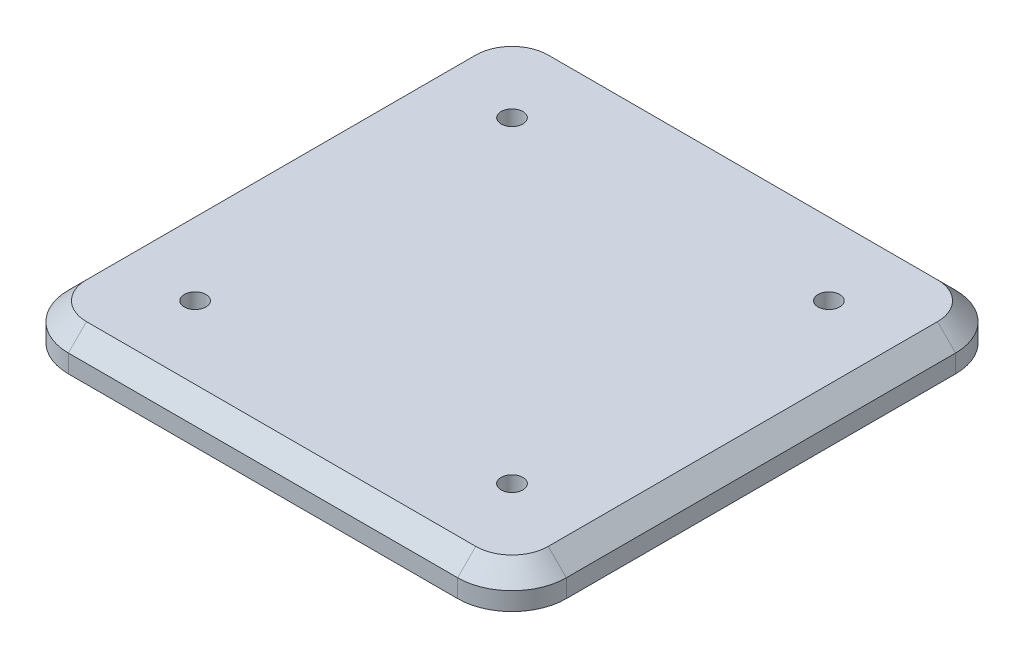
ISO-10303-21;
HEADER;
FILE_DESCRIPTION(('STEP AP214'),'2;1');
FILE_NAME('part.step','',(''),(''),'','','');
FILE_SCHEMA(('AUTOMOTIVE_DESIGN { 1 0 10303 214 1 1 1 1 }'));
ENDSEC;
DATA;
#1=APPLICATION_CONTEXT('core data for automotive mechanical design processes');
#2=APPLICATION_PROTOCOL_DEFINITION('international standard','automotive_design',2000,#1);
#3=PRODUCT_CONTEXT('',#1,'mechanical');
#4=PRODUCT('Part','Part','',(#3));
#5=PRODUCT_RELATED_PRODUCT_CATEGORY('part','',(#4));
#6=PRODUCT_DEFINITION_FORMATION('','',#4);
#7=PRODUCT_DEFINITION_CONTEXT('part definition',#1,'design');
#8=PRODUCT_DEFINITION('design','',#6,#7);
#9=PRODUCT_DEFINITION_SHAPE('','',#8);
#10=(LENGTH_UNIT() NAMED_UNIT(*) SI_UNIT(.MILLI.,.METRE.));
#11=(NAMED_UNIT(*) PLANE_ANGLE_UNIT() SI_UNIT($,.RADIAN.));
#12=(NAMED_UNIT(*) SI_UNIT($,.STERADIAN.) SOLID_ANGLE_UNIT());
#13=UNCERTAINTY_MEASURE_WITH_UNIT(LENGTH_MEASURE(1.E-05),#10,'distance_accuracy_value','');
#14=(GEOMETRIC_REPRESENTATION_CONTEXT(3) GLOBAL_UNCERTAINTY_ASSIGNED_CONTEXT((#13)) GLOBAL_UNIT_ASSIGNED_CONTEXT((#10,
#11,#12)) REPRESENTATION_CONTEXT('',''));
#15=CARTESIAN_POINT('',(0.,0.,0.));
#16=DIRECTION('',(0.,0.,1.));
#17=DIRECTION('',(1.,0.,0.));
#18=AXIS2_PLACEMENT_3D('',#15,#16,#17);
#19=CARTESIAN_POINT('',(0.,20.,0.));
#20=DIRECTION('',(1.,0.,0.));
#21=DIRECTION('',(0.,0.,-1.));
#22=AXIS2_PLACEMENT_3D('',#19,#20,#21);
#23=PLANE('',#22);
#24=DIRECTION('',(0.,-1.,0.));
#25=VECTOR('',#24,1.);
#26=CARTESIAN_POINT('',(0.,20.,-30.));
#27=LINE('',#26,#25);
#28=CARTESIAN_POINT('',(0.,0.,-30.));
#29=VERTEX_POINT('',#28);
#30=CARTESIAN_POINT('',(0.,9.99999999999999,-30.));
#31=VERTEX_POINT('',#30);
#32=EDGE_CURVE('E215',#29,#31,#27,.F.);
#33=ORIENTED_EDGE('',*,*,#32,.T.);
#34=DIRECTION('',(0.,0.,-1.));
#35=VECTOR('',#34,1.);
#36=CARTESIAN_POINT('',(0.,9.99999999999999,0.));
#37=LINE('',#36,#35);
#38=CARTESIAN_POINT('',(0.,9.99999999999999,-245.));
#39=VERTEX_POINT('',#38);
#40=EDGE_CURVE('E259',#31,#39,#37,.T.);
#41=ORIENTED_EDGE('',*,*,#40,.T.);
#42=DIRECTION('',(0.,-1.,0.));
#43=VECTOR('',#42,1.);
#44=CARTESIAN_POINT('',(0.,20.,-245.));
#45=LINE('',#44,#43);
#46=CARTESIAN_POINT('',(0.,0.,-245.));
#47=VERTEX_POINT('',#46);
#48=EDGE_CURVE('E218',#39,#47,#45,.T.);
#49=ORIENTED_EDGE('',*,*,#48,.T.);
#50=DIRECTION('',(0.,0.,1.));
#51=VECTOR('',#50,1.);
#52=CARTESIAN_POINT('',(0.,0.,0.));
#53=LINE('',#52,#51);
#54=EDGE_CURVE('E203',#47,#29,#53,.T.);
#55=ORIENTED_EDGE('',*,*,#54,.T.);
#56=EDGE_LOOP('',(#33,#41,#49,#55));
#57=FACE_BOUND('',#56,.T.);
#58=ADVANCED_FACE('F33',(#57),#23,.F.);
#59=CARTESIAN_POINT('',(0.,20.,0.));
#60=DIRECTION('',(0.,0.,-1.));
#61=DIRECTION('',(-1.,0.,0.));
#62=AXIS2_PLACEMENT_3D('',#59,#60,#61);
#63=PLANE('',#62);
#64=DIRECTION('',(0.,-1.,0.));
#65=VECTOR('',#64,1.);
#66=CARTESIAN_POINT('',(245.,20.,0.));
#67=LINE('',#66,#65);
#68=CARTESIAN_POINT('',(245.,0.,0.));
#69=VERTEX_POINT('',#68);
#70=CARTESIAN_POINT('',(245.,9.99999999999999,0.));
#71=VERTEX_POINT('',#70);
#72=EDGE_CURVE('E239',#69,#71,#67,.F.);
#73=ORIENTED_EDGE('',*,*,#72,.T.);
#74=DIRECTION('',(-1.,0.,0.));
#75=VECTOR('',#74,1.);
#76=CARTESIAN_POINT('',(0.,9.99999999999999,0.));
#77=LINE('',#76,#75);
#78=CARTESIAN_POINT('',(30.,9.99999999999999,0.));
#79=VERTEX_POINT('',#78);
#80=EDGE_CURVE('E266',#71,#79,#77,.T.);
#81=ORIENTED_EDGE('',*,*,#80,.T.);
#82=DIRECTION('',(0.,-1.,0.));
#83=VECTOR('',#82,1.);
#84=CARTESIAN_POINT('',(30.,20.,0.));
#85=LINE('',#84,#83);
#86=CARTESIAN_POINT('',(30.,0.,0.));
#87=VERTEX_POINT('',#86);
#88=EDGE_CURVE('E237',#79,#87,#85,.T.);
#89=ORIENTED_EDGE('',*,*,#88,.T.);
#90=DIRECTION('',(1.,0.,0.));
#91=VECTOR('',#90,1.);
#92=CARTESIAN_POINT('',(0.,0.,0.));
#93=LINE('',#92,#91);
#94=EDGE_CURVE('E206',#87,#69,#93,.T.);
#95=ORIENTED_EDGE('',*,*,#94,.T.);
#96=EDGE_LOOP('',(#73,#81,#89,#95));
#97=FACE_BOUND('',#96,.T.);
#98=ADVANCED_FACE('F309',(#97),#63,.F.);
#99=CARTESIAN_POINT('',(275.,20.,0.));
#100=DIRECTION('',(-1.,0.,0.));
#101=DIRECTION('',(0.,0.,1.));
#102=AXIS2_PLACEMENT_3D('',#99,#100,#101);
#103=PLANE('',#102);
#104=DIRECTION('',(0.,-1.,0.));
#105=VECTOR('',#104,1.);
#106=CARTESIAN_POINT('',(275.,20.,-245.));
#107=LINE('',#106,#105);
#108=CARTESIAN_POINT('',(275.,0.,-245.));
#109=VERTEX_POINT('',#108);
#110=CARTESIAN_POINT('',(275.,9.99999999999999,-245.));
#111=VERTEX_POINT('',#110);
#112=EDGE_CURVE('E235',#109,#111,#107,.F.);
#113=ORIENTED_EDGE('',*,*,#112,.T.);
#114=DIRECTION('',(0.,0.,1.));
#115=VECTOR('',#114,1.);
#116=CARTESIAN_POINT('',(275.,9.99999999999999,0.));
#117=LINE('',#116,#115);
#118=CARTESIAN_POINT('',(275.,9.99999999999999,-30.));
#119=VERTEX_POINT('',#118);
#120=EDGE_CURVE('E11',#111,#119,#117,.T.);
#121=ORIENTED_EDGE('',*,*,#120,.T.);
#122=DIRECTION('',(0.,-1.,0.));
#123=VECTOR('',#122,1.);
#124=CARTESIAN_POINT('',(275.,20.,-30.));
#125=LINE('',#124,#123);
#126=CARTESIAN_POINT('',(275.,0.,-30.));
#127=VERTEX_POINT('',#126);
#128=EDGE_CURVE('E233',#119,#127,#125,.T.);
#129=ORIENTED_EDGE('',*,*,#128,.T.);
#130=DIRECTION('',(0.,0.,-1.));
#131=VECTOR('',#130,1.);
#132=CARTESIAN_POINT('',(275.,0.,0.));
#133=LINE('',#132,#131);
#134=EDGE_CURVE('E209',#127,#109,#133,.T.);
#135=ORIENTED_EDGE('',*,*,#134,.T.);
#136=EDGE_LOOP('',(#113,#121,#129,#135));
#137=FACE_BOUND('',#136,.T.);
#138=ADVANCED_FACE('F319',(#137),#103,.F.);
#139=CARTESIAN_POINT('',(0.,20.,-275.));
#140=DIRECTION('',(0.,0.,1.));
#141=DIRECTION('',(1.,0.,0.));
#142=AXIS2_PLACEMENT_3D('',#139,#140,#141);
#143=PLANE('',#142);
#144=DIRECTION('',(0.,-1.,0.));
#145=VECTOR('',#144,1.);
#146=CARTESIAN_POINT('',(30.,20.,-275.));
#147=LINE('',#146,#145);
#148=CARTESIAN_POINT('',(30.,0.,-275.));
#149=VERTEX_POINT('',#148);
#150=CARTESIAN_POINT('',(30.,9.99999999999999,-275.));
#151=VERTEX_POINT('',#150);
#152=EDGE_CURVE('E230',#149,#151,#147,.F.);
#153=ORIENTED_EDGE('',*,*,#152,.T.);
#154=DIRECTION('',(1.,0.,0.));
#155=VECTOR('',#154,1.);
#156=CARTESIAN_POINT('',(0.,9.99999999999999,-275.));
#157=LINE('',#156,#155);
#158=CARTESIAN_POINT('',(245.,9.99999999999999,-275.));
#159=VERTEX_POINT('',#158);
#160=EDGE_CURVE('E268',#151,#159,#157,.T.);
#161=ORIENTED_EDGE('',*,*,#160,.T.);
#162=DIRECTION('',(0.,-1.,0.));
#163=VECTOR('',#162,1.);
#164=CARTESIAN_POINT('',(245.,20.,-275.));
#165=LINE('',#164,#163);
#166=CARTESIAN_POINT('',(245.,0.,-275.));
#167=VERTEX_POINT('',#166);
#168=EDGE_CURVE('E228',#159,#167,#165,.T.);
#169=ORIENTED_EDGE('',*,*,#168,.T.);
#170=DIRECTION('',(-1.,0.,0.));
#171=VECTOR('',#170,1.);
#172=CARTESIAN_POINT('',(0.,0.,-275.));
#173=LINE('',#172,#171);
#174=EDGE_CURVE('E212',#167,#149,#173,.T.);
#175=ORIENTED_EDGE('',*,*,#174,.T.);
#176=EDGE_LOOP('',(#153,#161,#169,#175));
#177=FACE_BOUND('',#176,.T.);
#178=ADVANCED_FACE('F324',(#177),#143,.F.);
#179=CARTESIAN_POINT('',(0.,20.,0.));
#180=DIRECTION('',(0.,-1.,0.));
#181=DIRECTION('',(0.,0.,-1.));
#182=AXIS2_PLACEMENT_3D('',#179,#180,#181);
#183=PLANE('',#182);
#184=CARTESIAN_POINT('',(50.,20.,-50.));
#185=DIRECTION('',(0.,1.,0.));
#186=DIRECTION('',(0.,0.,1.));
#187=AXIS2_PLACEMENT_3D('',#184,#185,#186);
#188=CIRCLE('',#187,5.99999999999999);
#189=CARTESIAN_POINT('',(50.,20.,-44.));
#190=VERTEX_POINT('',#189);
#191=EDGE_CURVE('E156',#190,#190,#188,.T.);
#192=ORIENTED_EDGE('',*,*,#191,.F.);
#193=EDGE_LOOP('',(#192));
#194=FACE_BOUND('',#193,.T.);
#195=CARTESIAN_POINT('',(50.,20.,-225.));
#196=DIRECTION('',(0.,1.,0.));
#197=DIRECTION('',(0.,0.,1.));
#198=AXIS2_PLACEMENT_3D('',#195,#196,#197);
#199=CIRCLE('',#198,5.99999999999999);
#200=CARTESIAN_POINT('',(50.,20.,-219.));
#201=VERTEX_POINT('',#200);
#202=EDGE_CURVE('E155',#201,#201,#199,.T.);
#203=ORIENTED_EDGE('',*,*,#202,.F.);
#204=EDGE_LOOP('',(#203));
#205=FACE_BOUND('',#204,.T.);
#206=CARTESIAN_POINT('',(225.,20.,-225.));
#207=DIRECTION('',(0.,1.,0.));
#208=DIRECTION('',(0.,0.,1.));
#209=AXIS2_PLACEMENT_3D('',#206,#207,#208);
#210=CIRCLE('',#209,5.99999999999998);
#211=CARTESIAN_POINT('',(225.,20.,-219.));
#212=VERTEX_POINT('',#211);
#213=EDGE_CURVE('E166',#212,#212,#210,.T.);
#214=ORIENTED_EDGE('',*,*,#213,.F.);
#215=EDGE_LOOP('',(#214));
#216=FACE_BOUND('',#215,.T.);
#217=CARTESIAN_POINT('',(225.,20.,-50.));
#218=DIRECTION('',(0.,1.,0.));
#219=DIRECTION('',(0.,0.,1.));
#220=AXIS2_PLACEMENT_3D('',#217,#218,#219);
#221=CIRCLE('',#220,5.99999999999998);
#222=CARTESIAN_POINT('',(225.,20.,-44.));
#223=VERTEX_POINT('',#222);
#224=EDGE_CURVE('E172',#223,#223,#221,.T.);
#225=ORIENTED_EDGE('',*,*,#224,.F.);
#226=EDGE_LOOP('',(#225));
#227=FACE_BOUND('',#226,.T.);
#228=CARTESIAN_POINT('',(30.,20.,-245.));
#229=DIRECTION('',(0.,-1.,0.));
#230=DIRECTION('',(0.,0.,-1.));
#231=AXIS2_PLACEMENT_3D('',#228,#229,#230);
#232=CIRCLE('',#231,20.0000000000001);
#233=CARTESIAN_POINT('',(30.,20.,-265.));
#234=VERTEX_POINT('',#233);
#235=CARTESIAN_POINT('',(9.9999999999999,20.,-245.));
#236=VERTEX_POINT('',#235);
#237=EDGE_CURVE('E252',#234,#236,#232,.F.);
#238=ORIENTED_EDGE('',*,*,#237,.T.);
#239=DIRECTION('',(0.,0.,1.));
#240=VECTOR('',#239,1.);
#241=CARTESIAN_POINT('',(9.9999999999999,20.,0.));
#242=LINE('',#241,#240);
#243=CARTESIAN_POINT('',(9.9999999999999,20.,-30.));
#244=VERTEX_POINT('',#243);
#245=EDGE_CURVE('E256',#236,#244,#242,.T.);
#246=ORIENTED_EDGE('',*,*,#245,.T.);
#247=CARTESIAN_POINT('',(30.,20.,-30.));
#248=DIRECTION('',(0.,-1.,0.));
#249=DIRECTION('',(0.,0.,-1.));
#250=AXIS2_PLACEMENT_3D('',#247,#248,#249);
#251=CIRCLE('',#250,20.0000000000001);
#252=CARTESIAN_POINT('',(30.,20.,-9.9999999999999));
#253=VERTEX_POINT('',#252);
#254=EDGE_CURVE('E254',#244,#253,#251,.F.);
#255=ORIENTED_EDGE('',*,*,#254,.T.);
#256=DIRECTION('',(1.,0.,0.));
#257=VECTOR('',#256,1.);
#258=CARTESIAN_POINT('',(0.,20.,-9.9999999999999));
#259=LINE('',#258,#257);
#260=CARTESIAN_POINT('',(245.,20.,-9.9999999999999));
#261=VERTEX_POINT('',#260);
#262=EDGE_CURVE('E250',#253,#261,#259,.T.);
#263=ORIENTED_EDGE('',*,*,#262,.T.);
#264=CARTESIAN_POINT('',(245.,20.,-30.));
#265=DIRECTION('',(0.,-1.,0.));
#266=DIRECTION('',(0.,0.,-1.));
#267=AXIS2_PLACEMENT_3D('',#264,#265,#266);
#268=CIRCLE('',#267,20.0000000000001);
#269=CARTESIAN_POINT('',(265.,20.,-30.));
#270=VERTEX_POINT('',#269);
#271=EDGE_CURVE('E246',#261,#270,#268,.F.);
#272=ORIENTED_EDGE('',*,*,#271,.T.);
#273=DIRECTION('',(0.,0.,-1.));
#274=VECTOR('',#273,1.);
#275=CARTESIAN_POINT('',(265.,20.,0.));
#276=LINE('',#275,#274);
#277=CARTESIAN_POINT('',(265.,20.,-245.));
#278=VERTEX_POINT('',#277);
#279=EDGE_CURVE('E242',#270,#278,#276,.T.);
#280=ORIENTED_EDGE('',*,*,#279,.T.);
#281=CARTESIAN_POINT('',(245.,20.,-245.));
#282=DIRECTION('',(0.,-1.,0.));
#283=DIRECTION('',(0.,0.,-1.));
#284=AXIS2_PLACEMENT_3D('',#281,#282,#283);
#285=CIRCLE('',#284,20.0000000000001);
#286=CARTESIAN_POINT('',(245.,20.,-265.));
#287=VERTEX_POINT('',#286);
#288=EDGE_CURVE('E244',#278,#287,#285,.F.);
#289=ORIENTED_EDGE('',*,*,#288,.T.);
#290=DIRECTION('',(-1.,0.,0.));
#291=VECTOR('',#290,1.);
#292=CARTESIAN_POINT('',(0.,20.,-265.));
#293=LINE('',#292,#291);
#294=EDGE_CURVE('E248',#287,#234,#293,.T.);
#295=ORIENTED_EDGE('',*,*,#294,.T.);
#296=EDGE_LOOP('',(#238,#246,#255,#263,#272,#280,#289,#295));
#297=FACE_BOUND('',#296,.T.);
#298=ADVANCED_FACE('F349',(#194,#205,#216,#227,#297),#183,.F.);
#299=CARTESIAN_POINT('',(0.,0.,0.));
#300=DIRECTION('',(0.,-1.,0.));
#301=DIRECTION('',(0.,0.,-1.));
#302=AXIS2_PLACEMENT_3D('',#299,#300,#301);
#303=PLANE('',#302);
#304=CARTESIAN_POINT('',(25.,0.,-25.));
#305=DIRECTION('',(0.,-1.,0.));
#306=DIRECTION('',(0.,0.,-1.));
#307=AXIS2_PLACEMENT_3D('',#304,#305,#306);
#308=CIRCLE('',#307,5.99999999999999);
#309=CARTESIAN_POINT('',(25.,0.,-31.));
#310=VERTEX_POINT('',#309);
#311=EDGE_CURVE('E178',#310,#310,#308,.T.);
#312=ORIENTED_EDGE('',*,*,#311,.F.);
#313=EDGE_LOOP('',(#312));
#314=FACE_BOUND('',#313,.T.);
#315=CARTESIAN_POINT('',(250.,0.,-25.));
#316=DIRECTION('',(0.,-1.,0.));
#317=DIRECTION('',(0.,0.,-1.));
#318=AXIS2_PLACEMENT_3D('',#315,#316,#317);
#319=CIRCLE('',#318,6.00000000000001);
#320=CARTESIAN_POINT('',(250.,0.,-31.));
#321=VERTEX_POINT('',#320);
#322=EDGE_CURVE('E184',#321,#321,#319,.T.);
#323=ORIENTED_EDGE('',*,*,#322,.F.);
#324=EDGE_LOOP('',(#323));
#325=FACE_BOUND('',#324,.T.);
#326=CARTESIAN_POINT('',(250.,0.,-250.));
#327=DIRECTION('',(0.,-1.,0.));
#328=DIRECTION('',(0.,0.,-1.));
#329=AXIS2_PLACEMENT_3D('',#326,#327,#328);
#330=CIRCLE('',#329,6.00000000000001);
#331=CARTESIAN_POINT('',(250.,0.,-256.));
#332=VERTEX_POINT('',#331);
#333=EDGE_CURVE('E190',#332,#332,#330,.T.);
#334=ORIENTED_EDGE('',*,*,#333,.F.);
#335=EDGE_LOOP('',(#334));
#336=FACE_BOUND('',#335,.T.);
#337=CARTESIAN_POINT('',(25.,0.,-250.));
#338=DIRECTION('',(0.,-1.,0.));
#339=DIRECTION('',(0.,0.,-1.));
#340=AXIS2_PLACEMENT_3D('',#337,#338,#339);
#341=CIRCLE('',#340,5.99999999999999);
#342=CARTESIAN_POINT('',(25.,0.,-256.));
#343=VERTEX_POINT('',#342);
#344=EDGE_CURVE('E196',#343,#343,#341,.T.);
#345=ORIENTED_EDGE('',*,*,#344,.F.);
#346=EDGE_LOOP('',(#345));
#347=FACE_BOUND('',#346,.T.);
#348=ORIENTED_EDGE('',*,*,#54,.F.);
#349=CARTESIAN_POINT('',(30.,0.,-245.));
#350=DIRECTION('',(0.,-1.,0.));
#351=DIRECTION('',(0.,0.,-1.));
#352=AXIS2_PLACEMENT_3D('',#349,#350,#351);
#353=CIRCLE('',#352,30.);
#354=EDGE_CURVE('E226',#47,#149,#353,.T.);
#355=ORIENTED_EDGE('',*,*,#354,.T.);
#356=ORIENTED_EDGE('',*,*,#174,.F.);
#357=CARTESIAN_POINT('',(245.,0.,-245.));
#358=DIRECTION('',(0.,-1.,0.));
#359=DIRECTION('',(0.,0.,-1.));
#360=AXIS2_PLACEMENT_3D('',#357,#358,#359);
#361=CIRCLE('',#360,30.);
#362=EDGE_CURVE('E224',#167,#109,#361,.T.);
#363=ORIENTED_EDGE('',*,*,#362,.T.);
#364=ORIENTED_EDGE('',*,*,#134,.F.);
#365=CARTESIAN_POINT('',(245.,0.,-30.));
#366=DIRECTION('',(0.,-1.,0.));
#367=DIRECTION('',(0.,0.,-1.));
#368=AXIS2_PLACEMENT_3D('',#365,#366,#367);
#369=CIRCLE('',#368,30.);
#370=EDGE_CURVE('E222',#127,#69,#369,.T.);
#371=ORIENTED_EDGE('',*,*,#370,.T.);
#372=ORIENTED_EDGE('',*,*,#94,.F.);
#373=CARTESIAN_POINT('',(30.,0.,-30.));
#374=DIRECTION('',(0.,-1.,0.));
#375=DIRECTION('',(0.,0.,-1.));
#376=AXIS2_PLACEMENT_3D('',#373,#374,#375);
#377=CIRCLE('',#376,30.);
#378=EDGE_CURVE('E220',#87,#29,#377,.T.);
#379=ORIENTED_EDGE('',*,*,#378,.T.);
#380=EDGE_LOOP('',(#348,#355,#356,#363,#364,#371,#372,#379));
#381=FACE_BOUND('',#380,.T.);
#382=ADVANCED_FACE('F315',(#314,#325,#336,#347,#381),#303,.T.);
#383=CARTESIAN_POINT('',(30.,20.,-245.));
#384=DIRECTION('',(0.,-1.,0.));
#385=DIRECTION('',(0.,0.,-1.));
#386=AXIS2_PLACEMENT_3D('',#383,#384,#385);
#387=CYLINDRICAL_SURFACE('',#386,30.);
#388=ORIENTED_EDGE('',*,*,#48,.F.);
#389=CARTESIAN_POINT('',(30.,9.99999999999999,-245.));
#390=DIRECTION('',(0.,-1.,0.));
#391=DIRECTION('',(0.,0.,-1.));
#392=AXIS2_PLACEMENT_3D('',#389,#390,#391);
#393=CIRCLE('',#392,30.);
#394=EDGE_CURVE('E264',#39,#151,#393,.T.);
#395=ORIENTED_EDGE('',*,*,#394,.T.);
#396=ORIENTED_EDGE('',*,*,#152,.F.);
#397=ORIENTED_EDGE('',*,*,#354,.F.);
#398=EDGE_LOOP('',(#388,#395,#396,#397));
#399=FACE_BOUND('',#398,.T.);
#400=ADVANCED_FACE('F328',(#399),#387,.T.);
#401=CARTESIAN_POINT('',(245.,20.,-245.));
#402=DIRECTION('',(0.,-1.,0.));
#403=DIRECTION('',(0.,0.,-1.));
#404=AXIS2_PLACEMENT_3D('',#401,#402,#403);
#405=CYLINDRICAL_SURFACE('',#404,30.);
#406=ORIENTED_EDGE('',*,*,#168,.F.);
#407=CARTESIAN_POINT('',(245.,9.99999999999999,-245.));
#408=DIRECTION('',(0.,-1.,0.));
#409=DIRECTION('',(0.,0.,-1.));
#410=AXIS2_PLACEMENT_3D('',#407,#408,#409);
#411=CIRCLE('',#410,30.);
#412=EDGE_CURVE('E42',#159,#111,#411,.T.);
#413=ORIENTED_EDGE('',*,*,#412,.T.);
#414=ORIENTED_EDGE('',*,*,#112,.F.);
#415=ORIENTED_EDGE('',*,*,#362,.F.);
#416=EDGE_LOOP('',(#406,#413,#414,#415));
#417=FACE_BOUND('',#416,.T.);
#418=ADVANCED_FACE('F320',(#417),#405,.T.);
#419=CARTESIAN_POINT('',(245.,20.,-30.));
#420=DIRECTION('',(0.,-1.,0.));
#421=DIRECTION('',(0.,0.,-1.));
#422=AXIS2_PLACEMENT_3D('',#419,#420,#421);
#423=CYLINDRICAL_SURFACE('',#422,30.);
#424=ORIENTED_EDGE('',*,*,#128,.F.);
#425=CARTESIAN_POINT('',(245.,9.99999999999999,-30.));
#426=DIRECTION('',(0.,-1.,0.));
#427=DIRECTION('',(0.,0.,-1.));
#428=AXIS2_PLACEMENT_3D('',#425,#426,#427);
#429=CIRCLE('',#428,30.);
#430=EDGE_CURVE('E270',#119,#71,#429,.T.);
#431=ORIENTED_EDGE('',*,*,#430,.T.);
#432=ORIENTED_EDGE('',*,*,#72,.F.);
#433=ORIENTED_EDGE('',*,*,#370,.F.);
#434=EDGE_LOOP('',(#424,#431,#432,#433));
#435=FACE_BOUND('',#434,.T.);
#436=ADVANCED_FACE('F306',(#435),#423,.T.);
#437=CARTESIAN_POINT('',(30.,20.,-30.));
#438=DIRECTION('',(0.,-1.,0.));
#439=DIRECTION('',(0.,0.,-1.));
#440=AXIS2_PLACEMENT_3D('',#437,#438,#439);
#441=CYLINDRICAL_SURFACE('',#440,30.);
#442=ORIENTED_EDGE('',*,*,#88,.F.);
#443=CARTESIAN_POINT('',(30.,9.99999999999999,-30.));
#444=DIRECTION('',(0.,-1.,0.));
#445=DIRECTION('',(0.,0.,-1.));
#446=AXIS2_PLACEMENT_3D('',#443,#444,#445);
#447=CIRCLE('',#446,30.);
#448=EDGE_CURVE('E262',#79,#31,#447,.T.);
#449=ORIENTED_EDGE('',*,*,#448,.T.);
#450=ORIENTED_EDGE('',*,*,#32,.F.);
#451=ORIENTED_EDGE('',*,*,#378,.F.);
#452=EDGE_LOOP('',(#442,#449,#450,#451));
#453=FACE_BOUND('',#452,.T.);
#454=ADVANCED_FACE('F377',(#453),#441,.T.);
#455=CARTESIAN_POINT('',(265.,20.,0.));
#456=DIRECTION('',(-0.707106781186551,-0.707106781186544,0.));
#457=DIRECTION('',(0.,0.,-1.));
#458=AXIS2_PLACEMENT_3D('',#455,#456,#457);
#459=PLANE('',#458);
#460=DIRECTION('',(-0.707106781186544,0.707106781186551,0.));
#461=VECTOR('',#460,1.);
#462=CARTESIAN_POINT('',(275.,9.99999999999999,-30.));
#463=LINE('',#462,#461);
#464=EDGE_CURVE('E287',#119,#270,#463,.T.);
#465=ORIENTED_EDGE('',*,*,#464,.F.);
#466=ORIENTED_EDGE('',*,*,#120,.F.);
#467=DIRECTION('',(0.707106781186544,-0.707106781186551,0.));
#468=VECTOR('',#467,1.);
#469=CARTESIAN_POINT('',(265.,20.,-245.));
#470=LINE('',#469,#468);
#471=EDGE_CURVE('E37',#278,#111,#470,.T.);
#472=ORIENTED_EDGE('',*,*,#471,.F.);
#473=ORIENTED_EDGE('',*,*,#279,.F.);
#474=EDGE_LOOP('',(#465,#466,#472,#473));
#475=FACE_BOUND('',#474,.T.);
#476=ADVANCED_FACE('F35',(#475),#459,.F.);
#477=CARTESIAN_POINT('',(245.,20.,-245.));
#478=DIRECTION('',(0.,-1.,0.));
#479=DIRECTION('',(0.,0.,-1.));
#480=AXIS2_PLACEMENT_3D('',#477,#478,#479);
#481=CONICAL_SURFACE('',#480,20.0000000000001,0.785398163397443);
#482=ORIENTED_EDGE('',*,*,#471,.T.);
#483=ORIENTED_EDGE('',*,*,#412,.F.);
#484=DIRECTION('',(0.,-0.707106781186551,-0.707106781186544));
#485=VECTOR('',#484,1.);
#486=CARTESIAN_POINT('',(245.,20.,-265.));
#487=LINE('',#486,#485);
#488=EDGE_CURVE('E285',#287,#159,#487,.T.);
#489=ORIENTED_EDGE('',*,*,#488,.F.);
#490=ORIENTED_EDGE('',*,*,#288,.F.);
#491=EDGE_LOOP('',(#482,#483,#489,#490));
#492=FACE_BOUND('',#491,.T.);
#493=ADVANCED_FACE('F297',(#492),#481,.T.);
#494=CARTESIAN_POINT('',(245.,20.,-30.));
#495=DIRECTION('',(0.,-1.,0.));
#496=DIRECTION('',(0.,0.,-1.));
#497=AXIS2_PLACEMENT_3D('',#494,#495,#496);
#498=CONICAL_SURFACE('',#497,20.0000000000001,0.785398163397443);
#499=ORIENTED_EDGE('',*,*,#464,.T.);
#500=ORIENTED_EDGE('',*,*,#271,.F.);
#501=DIRECTION('',(0.,0.707106781186551,-0.707106781186544));
#502=VECTOR('',#501,1.);
#503=CARTESIAN_POINT('',(245.,9.99999999999999,0.));
#504=LINE('',#503,#502);
#505=EDGE_CURVE('E282',#71,#261,#504,.T.);
#506=ORIENTED_EDGE('',*,*,#505,.F.);
#507=ORIENTED_EDGE('',*,*,#430,.F.);
#508=EDGE_LOOP('',(#499,#500,#506,#507));
#509=FACE_BOUND('',#508,.T.);
#510=ADVANCED_FACE('F302',(#509),#498,.T.);
#511=CARTESIAN_POINT('',(0.,20.,-265.));
#512=DIRECTION('',(0.,-0.707106781186544,0.707106781186551));
#513=DIRECTION('',(-1.,0.,0.));
#514=AXIS2_PLACEMENT_3D('',#511,#512,#513);
#515=PLANE('',#514);
#516=ORIENTED_EDGE('',*,*,#488,.T.);
#517=ORIENTED_EDGE('',*,*,#160,.F.);
#518=DIRECTION('',(0.,-0.707106781186551,-0.707106781186544));
#519=VECTOR('',#518,1.);
#520=CARTESIAN_POINT('',(30.,20.,-265.));
#521=LINE('',#520,#519);
#522=EDGE_CURVE('E279',#234,#151,#521,.T.);
#523=ORIENTED_EDGE('',*,*,#522,.F.);
#524=ORIENTED_EDGE('',*,*,#294,.F.);
#525=EDGE_LOOP('',(#516,#517,#523,#524));
#526=FACE_BOUND('',#525,.T.);
#527=ADVANCED_FACE('F352',(#526),#515,.F.);
#528=CARTESIAN_POINT('',(0.,20.,-9.9999999999999));
#529=DIRECTION('',(0.,-0.707106781186544,-0.707106781186551));
#530=DIRECTION('',(1.,0.,0.));
#531=AXIS2_PLACEMENT_3D('',#528,#529,#530);
#532=PLANE('',#531);
#533=ORIENTED_EDGE('',*,*,#505,.T.);
#534=ORIENTED_EDGE('',*,*,#262,.F.);
#535=DIRECTION('',(0.,0.707106781186551,-0.707106781186544));
#536=VECTOR('',#535,1.);
#537=CARTESIAN_POINT('',(30.,9.99999999999999,0.));
#538=LINE('',#537,#536);
#539=EDGE_CURVE('E276',#79,#253,#538,.T.);
#540=ORIENTED_EDGE('',*,*,#539,.F.);
#541=ORIENTED_EDGE('',*,*,#80,.F.);
#542=EDGE_LOOP('',(#533,#534,#540,#541));
#543=FACE_BOUND('',#542,.T.);
#544=ADVANCED_FACE('F354',(#543),#532,.F.);
#545=CARTESIAN_POINT('',(30.,20.,-245.));
#546=DIRECTION('',(0.,-1.,0.));
#547=DIRECTION('',(0.,0.,-1.));
#548=AXIS2_PLACEMENT_3D('',#545,#546,#547);
#549=CONICAL_SURFACE('',#548,20.0000000000001,0.785398163397443);
#550=ORIENTED_EDGE('',*,*,#522,.T.);
#551=ORIENTED_EDGE('',*,*,#394,.F.);
#552=DIRECTION('',(-0.707106781186544,-0.707106781186551,0.));
#553=VECTOR('',#552,1.);
#554=CARTESIAN_POINT('',(9.9999999999999,20.,-245.));
#555=LINE('',#554,#553);
#556=EDGE_CURVE('E274',#236,#39,#555,.T.);
#557=ORIENTED_EDGE('',*,*,#556,.F.);
#558=ORIENTED_EDGE('',*,*,#237,.F.);
#559=EDGE_LOOP('',(#550,#551,#557,#558));
#560=FACE_BOUND('',#559,.T.);
#561=ADVANCED_FACE('F332',(#560),#549,.T.);
#562=CARTESIAN_POINT('',(30.,20.,-30.));
#563=DIRECTION('',(0.,-1.,0.));
#564=DIRECTION('',(0.,0.,-1.));
#565=AXIS2_PLACEMENT_3D('',#562,#563,#564);
#566=CONICAL_SURFACE('',#565,20.0000000000001,0.785398163397443);
#567=ORIENTED_EDGE('',*,*,#539,.T.);
#568=ORIENTED_EDGE('',*,*,#254,.F.);
#569=DIRECTION('',(0.707106781186544,0.707106781186551,0.));
#570=VECTOR('',#569,1.);
#571=CARTESIAN_POINT('',(0.,9.99999999999999,-30.));
#572=LINE('',#571,#570);
#573=EDGE_CURVE('E202',#31,#244,#572,.T.);
#574=ORIENTED_EDGE('',*,*,#573,.F.);
#575=ORIENTED_EDGE('',*,*,#448,.F.);
#576=EDGE_LOOP('',(#567,#568,#574,#575));
#577=FACE_BOUND('',#576,.T.);
#578=ADVANCED_FACE('F345',(#577),#566,.T.);
#579=CARTESIAN_POINT('',(9.9999999999999,20.,0.));
#580=DIRECTION('',(0.707106781186551,-0.707106781186544,0.));
#581=DIRECTION('',(0.,0.,1.));
#582=AXIS2_PLACEMENT_3D('',#579,#580,#581);
#583=PLANE('',#582);
#584=ORIENTED_EDGE('',*,*,#556,.T.);
#585=ORIENTED_EDGE('',*,*,#40,.F.);
#586=ORIENTED_EDGE('',*,*,#573,.T.);
#587=ORIENTED_EDGE('',*,*,#245,.F.);
#588=EDGE_LOOP('',(#584,#585,#586,#587));
#589=FACE_BOUND('',#588,.T.);
#590=ADVANCED_FACE('F341',(#589),#583,.F.);
#591=CARTESIAN_POINT('',(25.,9.99999999999999,-250.));
#592=DIRECTION('',(0.,-1.,0.));
#593=DIRECTION('',(0.,0.,-1.));
#594=AXIS2_PLACEMENT_3D('',#591,#592,#593);
#595=CONICAL_SURFACE('',#594,5.99999999999999,1.02974425867666);
#596=CARTESIAN_POINT('',(25.,13.6051637141653,-250.));
#597=VERTEX_POINT('',#596);
#598=VERTEX_LOOP('',#597);
#599=FACE_BOUND('',#598,.T.);
#600=CARTESIAN_POINT('',(25.,9.99999999999999,-250.));
#601=DIRECTION('',(0.,-1.,0.));
#602=DIRECTION('',(0.,0.,-1.));
#603=AXIS2_PLACEMENT_3D('',#600,#601,#602);
#604=CIRCLE('',#603,5.99999999999999);
#605=CARTESIAN_POINT('',(25.,9.99999999999999,-256.));
#606=VERTEX_POINT('',#605);
#607=EDGE_CURVE('E199',#606,#606,#604,.T.);
#608=ORIENTED_EDGE('',*,*,#607,.T.);
#609=EDGE_LOOP('',(#608));
#610=FACE_BOUND('',#609,.T.);
#611=ADVANCED_FACE('F383',(#599,#610),#595,.F.);
#612=CARTESIAN_POINT('',(25.,0.,-250.));
#613=DIRECTION('',(0.,-1.,0.));
#614=DIRECTION('',(0.,0.,-1.));
#615=AXIS2_PLACEMENT_3D('',#612,#613,#614);
#616=CYLINDRICAL_SURFACE('',#615,5.99999999999999);
#617=ORIENTED_EDGE('',*,*,#607,.F.);
#618=EDGE_LOOP('',(#617));
#619=FACE_BOUND('',#618,.T.);
#620=ORIENTED_EDGE('',*,*,#344,.T.);
#621=EDGE_LOOP('',(#620));
#622=FACE_BOUND('',#621,.T.);
#623=ADVANCED_FACE('F406',(#619,#622),#616,.F.);
#624=CARTESIAN_POINT('',(250.,9.99999999999999,-250.));
#625=DIRECTION('',(0.,-1.,0.));
#626=DIRECTION('',(0.,0.,-1.));
#627=AXIS2_PLACEMENT_3D('',#624,#625,#626);
#628=CONICAL_SURFACE('',#627,6.00000000000001,1.02974425867666);
#629=CARTESIAN_POINT('',(250.,13.6051637141653,-250.));
#630=VERTEX_POINT('',#629);
#631=VERTEX_LOOP('',#630);
#632=FACE_BOUND('',#631,.T.);
#633=CARTESIAN_POINT('',(250.,9.99999999999999,-250.));
#634=DIRECTION('',(0.,-1.,0.));
#635=DIRECTION('',(0.,0.,-1.));
#636=AXIS2_PLACEMENT_3D('',#633,#634,#635);
#637=CIRCLE('',#636,6.00000000000001);
#638=CARTESIAN_POINT('',(250.,9.99999999999999,-256.));
#639=VERTEX_POINT('',#638);
#640=EDGE_CURVE('E193',#639,#639,#637,.T.);
#641=ORIENTED_EDGE('',*,*,#640,.T.);
#642=EDGE_LOOP('',(#641));
#643=FACE_BOUND('',#642,.T.);
#644=ADVANCED_FACE('F415',(#632,#643),#628,.F.);
#645=CARTESIAN_POINT('',(250.,0.,-250.));
#646=DIRECTION('',(0.,-1.,0.));
#647=DIRECTION('',(0.,0.,-1.));
#648=AXIS2_PLACEMENT_3D('',#645,#646,#647);
#649=CYLINDRICAL_SURFACE('',#648,6.00000000000001);
#650=ORIENTED_EDGE('',*,*,#640,.F.);
#651=EDGE_LOOP('',(#650));
#652=FACE_BOUND('',#651,.T.);
#653=ORIENTED_EDGE('',*,*,#333,.T.);
#654=EDGE_LOOP('',(#653));
#655=FACE_BOUND('',#654,.T.);
#656=ADVANCED_FACE('F423',(#652,#655),#649,.F.);
#657=CARTESIAN_POINT('',(250.,9.99999999999999,-25.));
#658=DIRECTION('',(0.,-1.,0.));
#659=DIRECTION('',(0.,0.,-1.));
#660=AXIS2_PLACEMENT_3D('',#657,#658,#659);
#661=CONICAL_SURFACE('',#660,6.00000000000001,1.02974425867666);
#662=CARTESIAN_POINT('',(250.,13.6051637141653,-25.));
#663=VERTEX_POINT('',#662);
#664=VERTEX_LOOP('',#663);
#665=FACE_BOUND('',#664,.T.);
#666=CARTESIAN_POINT('',(250.,9.99999999999999,-25.));
#667=DIRECTION('',(0.,-1.,0.));
#668=DIRECTION('',(0.,0.,-1.));
#669=AXIS2_PLACEMENT_3D('',#666,#667,#668);
#670=CIRCLE('',#669,6.00000000000001);
#671=CARTESIAN_POINT('',(250.,9.99999999999999,-31.));
#672=VERTEX_POINT('',#671);
#673=EDGE_CURVE('E187',#672,#672,#670,.T.);
#674=ORIENTED_EDGE('',*,*,#673,.T.);
#675=EDGE_LOOP('',(#674));
#676=FACE_BOUND('',#675,.T.);
#677=ADVANCED_FACE('F431',(#665,#676),#661,.F.);
#678=CARTESIAN_POINT('',(250.,0.,-25.));
#679=DIRECTION('',(0.,-1.,0.));
#680=DIRECTION('',(0.,0.,-1.));
#681=AXIS2_PLACEMENT_3D('',#678,#679,#680);
#682=CYLINDRICAL_SURFACE('',#681,6.00000000000001);
#683=ORIENTED_EDGE('',*,*,#673,.F.);
#684=EDGE_LOOP('',(#683));
#685=FACE_BOUND('',#684,.T.);
#686=ORIENTED_EDGE('',*,*,#322,.T.);
#687=EDGE_LOOP('',(#686));
#688=FACE_BOUND('',#687,.T.);
#689=ADVANCED_FACE('F439',(#685,#688),#682,.F.);
#690=CARTESIAN_POINT('',(25.,9.99999999999999,-25.));
#691=DIRECTION('',(0.,-1.,0.));
#692=DIRECTION('',(0.,0.,-1.));
#693=AXIS2_PLACEMENT_3D('',#690,#691,#692);
#694=CONICAL_SURFACE('',#693,5.99999999999999,1.02974425867666);
#695=CARTESIAN_POINT('',(25.,13.6051637141653,-25.));
#696=VERTEX_POINT('',#695);
#697=VERTEX_LOOP('',#696);
#698=FACE_BOUND('',#697,.T.);
#699=CARTESIAN_POINT('',(25.,9.99999999999999,-25.));
#700=DIRECTION('',(0.,-1.,0.));
#701=DIRECTION('',(0.,0.,-1.));
#702=AXIS2_PLACEMENT_3D('',#699,#700,#701);
#703=CIRCLE('',#702,5.99999999999999);
#704=CARTESIAN_POINT('',(25.,9.99999999999999,-31.));
#705=VERTEX_POINT('',#704);
#706=EDGE_CURVE('E181',#705,#705,#703,.T.);
#707=ORIENTED_EDGE('',*,*,#706,.T.);
#708=EDGE_LOOP('',(#707));
#709=FACE_BOUND('',#708,.T.);
#710=ADVANCED_FACE('F447',(#698,#709),#694,.F.);
#711=CARTESIAN_POINT('',(25.,0.,-25.));
#712=DIRECTION('',(0.,-1.,0.));
#713=DIRECTION('',(0.,0.,-1.));
#714=AXIS2_PLACEMENT_3D('',#711,#712,#713);
#715=CYLINDRICAL_SURFACE('',#714,5.99999999999999);
#716=ORIENTED_EDGE('',*,*,#706,.F.);
#717=EDGE_LOOP('',(#716));
#718=FACE_BOUND('',#717,.T.);
#719=ORIENTED_EDGE('',*,*,#311,.T.);
#720=EDGE_LOOP('',(#719));
#721=FACE_BOUND('',#720,.T.);
#722=ADVANCED_FACE('F455',(#718,#721),#715,.F.);
#723=CARTESIAN_POINT('',(225.,10.,-50.));
#724=DIRECTION('',(0.,1.,0.));
#725=DIRECTION('',(0.,0.,1.));
#726=AXIS2_PLACEMENT_3D('',#723,#724,#725);
#727=CONICAL_SURFACE('',#726,5.99999999999998,1.02974425867665);
#728=CARTESIAN_POINT('',(225.,6.39483628583466,-50.));
#729=VERTEX_POINT('',#728);
#730=VERTEX_LOOP('',#729);
#731=FACE_BOUND('',#730,.T.);
#732=CARTESIAN_POINT('',(225.,10.,-50.));
#733=DIRECTION('',(0.,1.,0.));
#734=DIRECTION('',(0.,0.,1.));
#735=AXIS2_PLACEMENT_3D('',#732,#733,#734);
#736=CIRCLE('',#735,5.99999999999998);
#737=CARTESIAN_POINT('',(225.,10.,-44.));
#738=VERTEX_POINT('',#737);
#739=EDGE_CURVE('E175',#738,#738,#736,.T.);
#740=ORIENTED_EDGE('',*,*,#739,.T.);
#741=EDGE_LOOP('',(#740));
#742=FACE_BOUND('',#741,.T.);
#743=ADVANCED_FACE('F463',(#731,#742),#727,.F.);
#744=CARTESIAN_POINT('',(225.,20.,-50.));
#745=DIRECTION('',(0.,1.,0.));
#746=DIRECTION('',(0.,0.,1.));
#747=AXIS2_PLACEMENT_3D('',#744,#745,#746);
#748=CYLINDRICAL_SURFACE('',#747,5.99999999999998);
#749=ORIENTED_EDGE('',*,*,#739,.F.);
#750=EDGE_LOOP('',(#749));
#751=FACE_BOUND('',#750,.T.);
#752=ORIENTED_EDGE('',*,*,#224,.T.);
#753=EDGE_LOOP('',(#752));
#754=FACE_BOUND('',#753,.T.);
#755=ADVANCED_FACE('F471',(#751,#754),#748,.F.);
#756=CARTESIAN_POINT('',(225.,10.,-225.));
#757=DIRECTION('',(0.,1.,0.));
#758=DIRECTION('',(0.,0.,1.));
#759=AXIS2_PLACEMENT_3D('',#756,#757,#758);
#760=CONICAL_SURFACE('',#759,5.99999999999998,1.02974425867665);
#761=CARTESIAN_POINT('',(225.,6.39483628583466,-225.));
#762=VERTEX_POINT('',#761);
#763=VERTEX_LOOP('',#762);
#764=FACE_BOUND('',#763,.T.);
#765=CARTESIAN_POINT('',(225.,10.,-225.));
#766=DIRECTION('',(0.,1.,0.));
#767=DIRECTION('',(0.,0.,1.));
#768=AXIS2_PLACEMENT_3D('',#765,#766,#767);
#769=CIRCLE('',#768,5.99999999999998);
#770=CARTESIAN_POINT('',(225.,10.,-219.));
#771=VERTEX_POINT('',#770);
#772=EDGE_CURVE('E169',#771,#771,#769,.T.);
#773=ORIENTED_EDGE('',*,*,#772,.T.);
#774=EDGE_LOOP('',(#773));
#775=FACE_BOUND('',#774,.T.);
#776=ADVANCED_FACE('F479',(#764,#775),#760,.F.);
#777=CARTESIAN_POINT('',(225.,20.,-225.));
#778=DIRECTION('',(0.,1.,0.));
#779=DIRECTION('',(0.,0.,1.));
#780=AXIS2_PLACEMENT_3D('',#777,#778,#779);
#781=CYLINDRICAL_SURFACE('',#780,5.99999999999998);
#782=ORIENTED_EDGE('',*,*,#772,.F.);
#783=EDGE_LOOP('',(#782));
#784=FACE_BOUND('',#783,.T.);
#785=ORIENTED_EDGE('',*,*,#213,.T.);
#786=EDGE_LOOP('',(#785));
#787=FACE_BOUND('',#786,.T.);
#788=ADVANCED_FACE('F487',(#784,#787),#781,.F.);
#789=CARTESIAN_POINT('',(50.,10.,-225.));
#790=DIRECTION('',(0.,1.,0.));
#791=DIRECTION('',(0.,0.,1.));
#792=AXIS2_PLACEMENT_3D('',#789,#790,#791);
#793=CONICAL_SURFACE('',#792,5.99999999999999,1.02974425867666);
#794=CARTESIAN_POINT('',(50.,6.39483628583466,-225.));
#795=VERTEX_POINT('',#794);
#796=VERTEX_LOOP('',#795);
#797=FACE_BOUND('',#796,.T.);
#798=CARTESIAN_POINT('',(50.,10.,-225.));
#799=DIRECTION('',(0.,1.,0.));
#800=DIRECTION('',(0.,0.,1.));
#801=AXIS2_PLACEMENT_3D('',#798,#799,#800);
#802=CIRCLE('',#801,5.99999999999999);
#803=CARTESIAN_POINT('',(50.,10.,-219.));
#804=VERTEX_POINT('',#803);
#805=EDGE_CURVE('E159',#804,#804,#802,.T.);
#806=ORIENTED_EDGE('',*,*,#805,.T.);
#807=EDGE_LOOP('',(#806));
#808=FACE_BOUND('',#807,.T.);
#809=ADVANCED_FACE('F495',(#797,#808),#793,.F.);
#810=CARTESIAN_POINT('',(50.,20.,-225.));
#811=DIRECTION('',(0.,1.,0.));
#812=DIRECTION('',(0.,0.,1.));
#813=AXIS2_PLACEMENT_3D('',#810,#811,#812);
#814=CYLINDRICAL_SURFACE('',#813,5.99999999999999);
#815=ORIENTED_EDGE('',*,*,#805,.F.);
#816=EDGE_LOOP('',(#815));
#817=FACE_BOUND('',#816,.T.);
#818=ORIENTED_EDGE('',*,*,#202,.T.);
#819=EDGE_LOOP('',(#818));
#820=FACE_BOUND('',#819,.T.);
#821=ADVANCED_FACE('F149',(#817,#820),#814,.F.);
#822=CARTESIAN_POINT('',(50.,10.,-50.));
#823=DIRECTION('',(0.,1.,0.));
#824=DIRECTION('',(0.,0.,1.));
#825=AXIS2_PLACEMENT_3D('',#822,#823,#824);
#826=CONICAL_SURFACE('',#825,5.99999999999999,1.02974425867666);
#827=CARTESIAN_POINT('',(50.,6.39483628583466,-50.));
#828=VERTEX_POINT('',#827);
#829=VERTEX_LOOP('',#828);
#830=FACE_BOUND('',#829,.T.);
#831=CARTESIAN_POINT('',(50.,10.,-50.));
#832=DIRECTION('',(0.,1.,0.));
#833=DIRECTION('',(0.,0.,1.));
#834=AXIS2_PLACEMENT_3D('',#831,#832,#833);
#835=CIRCLE('',#834,5.99999999999999);
#836=CARTESIAN_POINT('',(50.,10.,-44.));
#837=VERTEX_POINT('',#836);
#838=EDGE_CURVE('E153',#837,#837,#835,.T.);
#839=ORIENTED_EDGE('',*,*,#838,.T.);
#840=EDGE_LOOP('',(#839));
#841=FACE_BOUND('',#840,.T.);
#842=ADVANCED_FACE('F145',(#830,#841),#826,.F.);
#843=CARTESIAN_POINT('',(50.,20.,-50.));
#844=DIRECTION('',(0.,1.,0.));
#845=DIRECTION('',(0.,0.,1.));
#846=AXIS2_PLACEMENT_3D('',#843,#844,#845);
#847=CYLINDRICAL_SURFACE('',#846,5.99999999999999);
#848=ORIENTED_EDGE('',*,*,#838,.F.);
#849=EDGE_LOOP('',(#848));
#850=FACE_BOUND('',#849,.T.);
#851=ORIENTED_EDGE('',*,*,#191,.T.);
#852=EDGE_LOOP('',(#851));
#853=FACE_BOUND('',#852,.T.);
#854=ADVANCED_FACE('F148',(#850,#853),#847,.F.);
#855=CLOSED_SHELL('',(#58,#98,#138,#178,#298,#382,#400,#418,#436,#454,#476,#493,#510,#527,#544,
#561,#578,#590,#611,#623,#644,#656,#677,#689,#710,#722,#743,#755,#776,#788,#809,#821,#842,#854));
#856=MANIFOLD_SOLID_BREP('B2',#855);
#857=ADVANCED_BREP_SHAPE_REPRESENTATION('',(#18,#856),#14);
#858=SHAPE_DEFINITION_REPRESENTATION(#9,#857);
ENDSEC;
END-ISO-10303-21;
